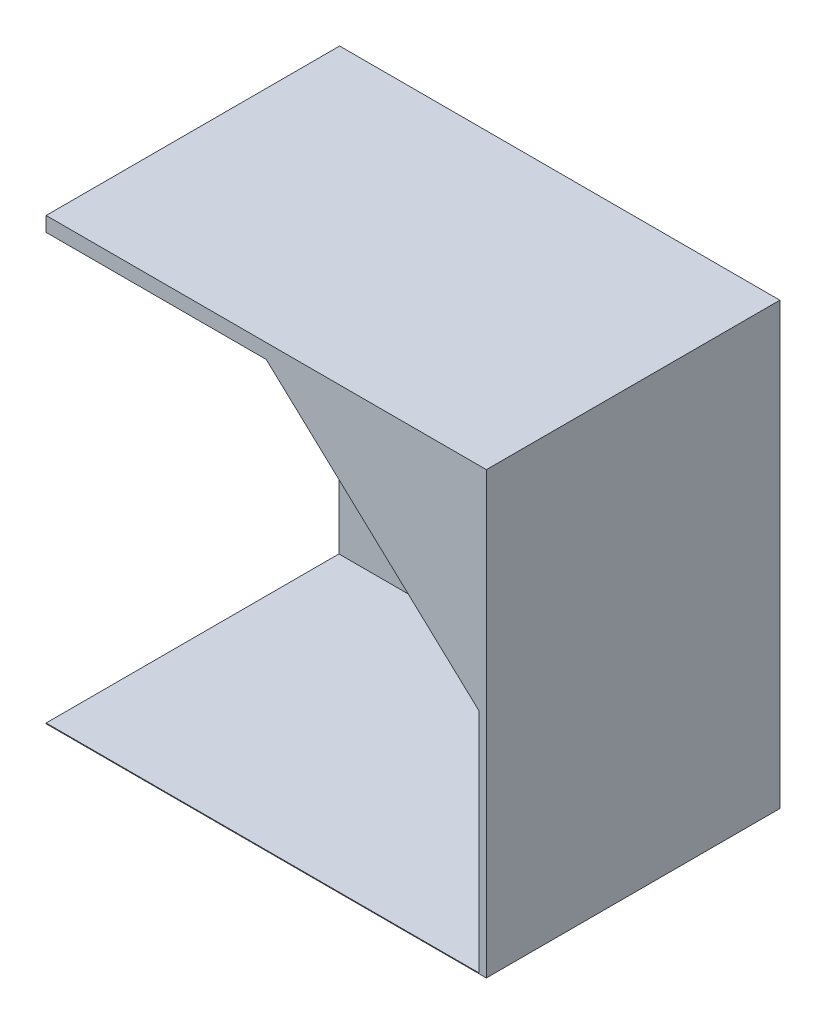
ISO-10303-21;
HEADER;
FILE_DESCRIPTION(('STEP AP214'),'2;1');
FILE_NAME('part.step','',(''),(''),'','','');
FILE_SCHEMA(('AUTOMOTIVE_DESIGN { 1 0 10303 214 1 1 1 1 }'));
ENDSEC;
DATA;
#1=APPLICATION_CONTEXT('core data for automotive mechanical design processes');
#2=APPLICATION_PROTOCOL_DEFINITION('international standard','automotive_design',2000,#1);
#3=PRODUCT_CONTEXT('',#1,'mechanical');
#4=PRODUCT('Part','Part','',(#3));
#5=PRODUCT_RELATED_PRODUCT_CATEGORY('part','',(#4));
#6=PRODUCT_DEFINITION_FORMATION('','',#4);
#7=PRODUCT_DEFINITION_CONTEXT('part definition',#1,'design');
#8=PRODUCT_DEFINITION('design','',#6,#7);
#9=PRODUCT_DEFINITION_SHAPE('','',#8);
#10=(LENGTH_UNIT() NAMED_UNIT(*) SI_UNIT(.MILLI.,.METRE.));
#11=(NAMED_UNIT(*) PLANE_ANGLE_UNIT() SI_UNIT($,.RADIAN.));
#12=(NAMED_UNIT(*) SI_UNIT($,.STERADIAN.) SOLID_ANGLE_UNIT());
#13=UNCERTAINTY_MEASURE_WITH_UNIT(LENGTH_MEASURE(1.E-05),#10,'distance_accuracy_value','');
#14=(GEOMETRIC_REPRESENTATION_CONTEXT(3) GLOBAL_UNCERTAINTY_ASSIGNED_CONTEXT((#13)) GLOBAL_UNIT_ASSIGNED_CONTEXT((#10,
#11,#12)) REPRESENTATION_CONTEXT('',''));
#15=CARTESIAN_POINT('',(0.,0.,0.));
#16=DIRECTION('',(0.,0.,1.));
#17=DIRECTION('',(1.,0.,0.));
#18=AXIS2_PLACEMENT_3D('',#15,#16,#17);
#19=CARTESIAN_POINT('',(-1500.,-1500.,2000.));
#20=DIRECTION('',(1.,0.,0.));
#21=DIRECTION('',(0.,0.,-1.));
#22=AXIS2_PLACEMENT_3D('',#19,#20,#21);
#23=PLANE('',#22);
#24=DIRECTION('',(0.,-1.,0.));
#25=VECTOR('',#24,1.);
#26=CARTESIAN_POINT('',(-1500.,-1500.,2000.));
#27=LINE('',#26,#25);
#28=CARTESIAN_POINT('',(-1500.,-1495.,2000.));
#29=VERTEX_POINT('',#28);
#30=CARTESIAN_POINT('',(-1500.,-1500.,2000.));
#31=VERTEX_POINT('',#30);
#32=EDGE_CURVE('E84',#29,#31,#27,.T.);
#33=ORIENTED_EDGE('',*,*,#32,.F.);
#34=DIRECTION('',(0.,0.,-1.));
#35=VECTOR('',#34,1.);
#36=CARTESIAN_POINT('',(-1500.,-1495.,2000.000012));
#37=LINE('',#36,#35);
#38=CARTESIAN_POINT('',(-1500.,-1495.,4.99999999999989));
#39=VERTEX_POINT('',#38);
#40=EDGE_CURVE('E149',#29,#39,#37,.T.);
#41=ORIENTED_EDGE('',*,*,#40,.T.);
#42=DIRECTION('',(0.,-1.,0.));
#43=VECTOR('',#42,1.);
#44=CARTESIAN_POINT('',(-1500.,0.,4.99999999999989));
#45=LINE('',#44,#43);
#46=CARTESIAN_POINT('',(-1500.,1400.,4.99999999999989));
#47=VERTEX_POINT('',#46);
#48=EDGE_CURVE('E134',#47,#39,#45,.T.);
#49=ORIENTED_EDGE('',*,*,#48,.F.);
#50=DIRECTION('',(0.,0.,-1.));
#51=VECTOR('',#50,1.);
#52=CARTESIAN_POINT('',(-1500.,1400.,2000.000012));
#53=LINE('',#52,#51);
#54=CARTESIAN_POINT('',(-1500.,1400.,2000.));
#55=VERTEX_POINT('',#54);
#56=EDGE_CURVE('E151',#55,#47,#53,.T.);
#57=ORIENTED_EDGE('',*,*,#56,.F.);
#58=CARTESIAN_POINT('',(-1500.,1500.,2000.));
#59=VERTEX_POINT('',#58);
#60=EDGE_CURVE('E155',#59,#55,#27,.T.);
#61=ORIENTED_EDGE('',*,*,#60,.F.);
#62=DIRECTION('',(0.,0.,-1.));
#63=VECTOR('',#62,1.);
#64=CARTESIAN_POINT('',(-1500.,1500.,2000.));
#65=LINE('',#64,#63);
#66=CARTESIAN_POINT('',(-1500.,1500.,0.));
#67=VERTEX_POINT('',#66);
#68=EDGE_CURVE('E162',#59,#67,#65,.T.);
#69=ORIENTED_EDGE('',*,*,#68,.T.);
#70=DIRECTION('',(0.,-1.,0.));
#71=VECTOR('',#70,1.);
#72=CARTESIAN_POINT('',(-1500.,-1500.,0.));
#73=LINE('',#72,#71);
#74=CARTESIAN_POINT('',(-1500.,-1500.,0.));
#75=VERTEX_POINT('',#74);
#76=EDGE_CURVE('E119',#67,#75,#73,.T.);
#77=ORIENTED_EDGE('',*,*,#76,.T.);
#78=DIRECTION('',(0.,0.,-1.));
#79=VECTOR('',#78,1.);
#80=CARTESIAN_POINT('',(-1500.,-1500.,2000.));
#81=LINE('',#80,#79);
#82=EDGE_CURVE('E176',#31,#75,#81,.T.);
#83=ORIENTED_EDGE('',*,*,#82,.F.);
#84=EDGE_LOOP('',(#33,#41,#49,#57,#61,#69,#77,#83));
#85=FACE_BOUND('',#84,.T.);
#86=ADVANCED_FACE('F33',(#85),#23,.F.);
#87=CARTESIAN_POINT('',(1500.,-1500.,2000.));
#88=DIRECTION('',(0.,1.,0.));
#89=DIRECTION('',(-1.,0.,0.));
#90=AXIS2_PLACEMENT_3D('',#87,#88,#89);
#91=PLANE('',#90);
#92=DIRECTION('',(1.,0.,0.));
#93=VECTOR('',#92,1.);
#94=CARTESIAN_POINT('',(1500.,-1500.,0.));
#95=LINE('',#94,#93);
#96=CARTESIAN_POINT('',(1500.,-1500.,0.));
#97=VERTEX_POINT('',#96);
#98=EDGE_CURVE('E165',#75,#97,#95,.T.);
#99=ORIENTED_EDGE('',*,*,#98,.T.);
#100=DIRECTION('',(0.,0.,-1.));
#101=VECTOR('',#100,1.);
#102=CARTESIAN_POINT('',(1500.,-1500.,2000.));
#103=LINE('',#102,#101);
#104=CARTESIAN_POINT('',(1500.,-1500.,2000.));
#105=VERTEX_POINT('',#104);
#106=EDGE_CURVE('E173',#105,#97,#103,.T.);
#107=ORIENTED_EDGE('',*,*,#106,.F.);
#108=DIRECTION('',(1.,0.,0.));
#109=VECTOR('',#108,1.);
#110=CARTESIAN_POINT('',(1500.,-1500.,2000.));
#111=LINE('',#110,#109);
#112=EDGE_CURVE('E157',#31,#105,#111,.T.);
#113=ORIENTED_EDGE('',*,*,#112,.F.);
#114=ORIENTED_EDGE('',*,*,#82,.T.);
#115=EDGE_LOOP('',(#99,#107,#113,#114));
#116=FACE_BOUND('',#115,.T.);
#117=ADVANCED_FACE('F194',(#116),#91,.F.);
#118=CARTESIAN_POINT('',(1500.,-1500.,2000.));
#119=DIRECTION('',(-1.,0.,0.));
#120=DIRECTION('',(0.,0.,1.));
#121=AXIS2_PLACEMENT_3D('',#118,#119,#120);
#122=PLANE('',#121);
#123=DIRECTION('',(0.,1.,0.));
#124=VECTOR('',#123,1.);
#125=CARTESIAN_POINT('',(1500.,-1500.,0.));
#126=LINE('',#125,#124);
#127=CARTESIAN_POINT('',(1500.,1500.,0.));
#128=VERTEX_POINT('',#127);
#129=EDGE_CURVE('E167',#97,#128,#126,.T.);
#130=ORIENTED_EDGE('',*,*,#129,.T.);
#131=DIRECTION('',(0.,0.,-1.));
#132=VECTOR('',#131,1.);
#133=CARTESIAN_POINT('',(1500.,1500.,2000.));
#134=LINE('',#133,#132);
#135=CARTESIAN_POINT('',(1500.,1500.,2000.));
#136=VERTEX_POINT('',#135);
#137=EDGE_CURVE('E171',#136,#128,#134,.T.);
#138=ORIENTED_EDGE('',*,*,#137,.F.);
#139=DIRECTION('',(0.,1.,0.));
#140=VECTOR('',#139,1.);
#141=CARTESIAN_POINT('',(1500.,-1500.,2000.));
#142=LINE('',#141,#140);
#143=EDGE_CURVE('E159',#105,#136,#142,.T.);
#144=ORIENTED_EDGE('',*,*,#143,.F.);
#145=ORIENTED_EDGE('',*,*,#106,.T.);
#146=EDGE_LOOP('',(#130,#138,#144,#145));
#147=FACE_BOUND('',#146,.T.);
#148=ADVANCED_FACE('F199',(#147),#122,.F.);
#149=CARTESIAN_POINT('',(1500.,1500.,2000.));
#150=DIRECTION('',(0.,-1.,0.));
#151=DIRECTION('',(1.,0.,0.));
#152=AXIS2_PLACEMENT_3D('',#149,#150,#151);
#153=PLANE('',#152);
#154=DIRECTION('',(-1.,0.,0.));
#155=VECTOR('',#154,1.);
#156=CARTESIAN_POINT('',(1500.,1500.,0.));
#157=LINE('',#156,#155);
#158=EDGE_CURVE('E77',#128,#67,#157,.T.);
#159=ORIENTED_EDGE('',*,*,#158,.T.);
#160=ORIENTED_EDGE('',*,*,#68,.F.);
#161=DIRECTION('',(-1.,0.,0.));
#162=VECTOR('',#161,1.);
#163=CARTESIAN_POINT('',(1500.,1500.,2000.));
#164=LINE('',#163,#162);
#165=EDGE_CURVE('E56',#136,#59,#164,.T.);
#166=ORIENTED_EDGE('',*,*,#165,.F.);
#167=ORIENTED_EDGE('',*,*,#137,.T.);
#168=EDGE_LOOP('',(#159,#160,#166,#167));
#169=FACE_BOUND('',#168,.T.);
#170=ADVANCED_FACE('F201',(#169),#153,.F.);
#171=CARTESIAN_POINT('',(0.,0.,2000.));
#172=DIRECTION('',(0.,0.,1.));
#173=DIRECTION('',(1.,0.,0.));
#174=AXIS2_PLACEMENT_3D('',#171,#172,#173);
#175=PLANE('',#174);
#176=DIRECTION('',(1.,0.,0.));
#177=VECTOR('',#176,1.);
#178=CARTESIAN_POINT('',(0.,-1495.,2000.));
#179=LINE('',#178,#177);
#180=CARTESIAN_POINT('',(1450.,-1495.,2000.));
#181=VERTEX_POINT('',#180);
#182=EDGE_CURVE('E11',#29,#181,#179,.T.);
#183=ORIENTED_EDGE('',*,*,#182,.F.);
#184=ORIENTED_EDGE('',*,*,#32,.T.);
#185=ORIENTED_EDGE('',*,*,#112,.T.);
#186=ORIENTED_EDGE('',*,*,#143,.T.);
#187=ORIENTED_EDGE('',*,*,#165,.T.);
#188=ORIENTED_EDGE('',*,*,#60,.T.);
#189=DIRECTION('',(1.,0.,0.));
#190=VECTOR('',#189,1.);
#191=CARTESIAN_POINT('',(-2.07241631263363E-13,1400.,2000.));
#192=LINE('',#191,#190);
#193=CARTESIAN_POINT('',(-1.30520867677086E-13,1400.,2000.));
#194=VERTEX_POINT('',#193);
#195=EDGE_CURVE('E179',#55,#194,#192,.T.);
#196=ORIENTED_EDGE('',*,*,#195,.T.);
#197=DIRECTION('',(-0.732204352927371,0.681085006114662,0.));
#198=VECTOR('',#197,1.);
#199=CARTESIAN_POINT('',(698.170768667009,750.572500224106,2000.));
#200=LINE('',#199,#198);
#201=CARTESIAN_POINT('',(1450.,51.2327399886134,2000.));
#202=VERTEX_POINT('',#201);
#203=EDGE_CURVE('E182',#202,#194,#200,.T.);
#204=ORIENTED_EDGE('',*,*,#203,.F.);
#205=DIRECTION('',(0.,1.,0.));
#206=VECTOR('',#205,1.);
#207=CARTESIAN_POINT('',(1450.,4.16450471930463E-13,2000.));
#208=LINE('',#207,#206);
#209=EDGE_CURVE('E40',#181,#202,#208,.T.);
#210=ORIENTED_EDGE('',*,*,#209,.F.);
#211=EDGE_LOOP('',(#183,#184,#185,#186,#187,#188,#196,#204,#210));
#212=FACE_BOUND('',#211,.T.);
#213=ADVANCED_FACE('F186',(#212),#175,.T.);
#214=CARTESIAN_POINT('',(0.,0.,0.));
#215=DIRECTION('',(0.,0.,1.));
#216=DIRECTION('',(1.,0.,0.));
#217=AXIS2_PLACEMENT_3D('',#214,#215,#216);
#218=PLANE('',#217);
#219=ORIENTED_EDGE('',*,*,#76,.F.);
#220=ORIENTED_EDGE('',*,*,#158,.F.);
#221=ORIENTED_EDGE('',*,*,#129,.F.);
#222=ORIENTED_EDGE('',*,*,#98,.F.);
#223=EDGE_LOOP('',(#219,#220,#221,#222));
#224=FACE_BOUND('',#223,.T.);
#225=ADVANCED_FACE('F203',(#224),#218,.F.);
#226=CARTESIAN_POINT('',(0.,-1495.,2000.000012));
#227=DIRECTION('',(0.,-1.,0.));
#228=DIRECTION('',(0.,0.,-1.));
#229=AXIS2_PLACEMENT_3D('',#226,#227,#228);
#230=PLANE('',#229);
#231=ORIENTED_EDGE('',*,*,#182,.T.);
#232=DIRECTION('',(0.,0.,-1.));
#233=VECTOR('',#232,1.);
#234=CARTESIAN_POINT('',(1450.,-1495.,2000.000012));
#235=LINE('',#234,#233);
#236=CARTESIAN_POINT('',(1450.,-1495.,4.99999999999989));
#237=VERTEX_POINT('',#236);
#238=EDGE_CURVE('E111',#181,#237,#235,.T.);
#239=ORIENTED_EDGE('',*,*,#238,.T.);
#240=DIRECTION('',(-1.,0.,0.));
#241=VECTOR('',#240,1.);
#242=CARTESIAN_POINT('',(0.,-1495.,4.99999999999989));
#243=LINE('',#242,#241);
#244=EDGE_CURVE('E115',#237,#39,#243,.T.);
#245=ORIENTED_EDGE('',*,*,#244,.T.);
#246=ORIENTED_EDGE('',*,*,#40,.F.);
#247=EDGE_LOOP('',(#231,#239,#245,#246));
#248=FACE_BOUND('',#247,.T.);
#249=ADVANCED_FACE('F113',(#248),#230,.F.);
#250=CARTESIAN_POINT('',(1450.,4.16450471930463E-13,2000.000012));
#251=DIRECTION('',(1.,0.,0.));
#252=DIRECTION('',(0.,1.,0.));
#253=AXIS2_PLACEMENT_3D('',#250,#251,#252);
#254=PLANE('',#253);
#255=ORIENTED_EDGE('',*,*,#209,.T.);
#256=DIRECTION('',(0.,0.,-1.));
#257=VECTOR('',#256,1.);
#258=CARTESIAN_POINT('',(1450.,51.2327399886134,2000.000012));
#259=LINE('',#258,#257);
#260=CARTESIAN_POINT('',(1450.,51.2327399886134,4.99999999999989));
#261=VERTEX_POINT('',#260);
#262=EDGE_CURVE('E120',#202,#261,#259,.T.);
#263=ORIENTED_EDGE('',*,*,#262,.T.);
#264=DIRECTION('',(0.,-1.,0.));
#265=VECTOR('',#264,1.);
#266=CARTESIAN_POINT('',(1450.,4.16450471930463E-13,4.99999999999989));
#267=LINE('',#266,#265);
#268=EDGE_CURVE('E123',#261,#237,#267,.T.);
#269=ORIENTED_EDGE('',*,*,#268,.T.);
#270=ORIENTED_EDGE('',*,*,#238,.F.);
#271=EDGE_LOOP('',(#255,#263,#269,#270));
#272=FACE_BOUND('',#271,.T.);
#273=ADVANCED_FACE('F124',(#272),#254,.F.);
#274=CARTESIAN_POINT('',(698.170768667009,750.572500224106,2000.000012));
#275=DIRECTION('',(0.681085006114662,0.732204352927371,0.));
#276=DIRECTION('',(-0.732204352927371,0.681085006114662,0.));
#277=AXIS2_PLACEMENT_3D('',#274,#275,#276);
#278=PLANE('',#277);
#279=CARTESIAN_POINT('',(725.,725.616369994307,1500.));
#280=DIRECTION('',(-0.681085006114662,-0.732204352927371,0.));
#281=DIRECTION('',(0.732204352927371,-0.681085006114662,0.));
#282=AXIS2_PLACEMENT_3D('',#279,#280,#281);
#283=CIRCLE('',#282,100.);
#284=CARTESIAN_POINT('',(798.220435292737,657.507869382841,1500.));
#285=VERTEX_POINT('',#284);
#286=EDGE_CURVE('E139',#285,#285,#283,.T.);
#287=ORIENTED_EDGE('',*,*,#286,.F.);
#288=EDGE_LOOP('',(#287));
#289=FACE_BOUND('',#288,.T.);
#290=CARTESIAN_POINT('',(725.,725.616369994307,1002.5));
#291=DIRECTION('',(-0.681085006114662,-0.732204352927371,0.));
#292=DIRECTION('',(0.732204352927371,-0.681085006114662,0.));
#293=AXIS2_PLACEMENT_3D('',#290,#291,#292);
#294=CIRCLE('',#293,100.);
#295=CARTESIAN_POINT('',(798.220435292737,657.507869382841,1002.5));
#296=VERTEX_POINT('',#295);
#297=EDGE_CURVE('E344',#296,#296,#294,.T.);
#298=ORIENTED_EDGE('',*,*,#297,.F.);
#299=EDGE_LOOP('',(#298));
#300=FACE_BOUND('',#299,.T.);
#301=CARTESIAN_POINT('',(725.,725.616369994307,500.));
#302=DIRECTION('',(-0.681085006114662,-0.732204352927371,0.));
#303=DIRECTION('',(0.732204352927371,-0.681085006114662,0.));
#304=AXIS2_PLACEMENT_3D('',#301,#302,#303);
#305=CIRCLE('',#304,100.);
#306=CARTESIAN_POINT('',(798.220435292737,657.507869382841,500.));
#307=VERTEX_POINT('',#306);
#308=EDGE_CURVE('E142',#307,#307,#305,.T.);
#309=ORIENTED_EDGE('',*,*,#308,.F.);
#310=EDGE_LOOP('',(#309));
#311=FACE_BOUND('',#310,.T.);
#312=ORIENTED_EDGE('',*,*,#203,.T.);
#313=DIRECTION('',(0.,0.,-1.));
#314=VECTOR('',#313,1.);
#315=CARTESIAN_POINT('',(-1.30520867677086E-13,1400.,2000.000012));
#316=LINE('',#315,#314);
#317=CARTESIAN_POINT('',(-1.30520867677086E-13,1400.,4.99999999999989));
#318=VERTEX_POINT('',#317);
#319=EDGE_CURVE('E47',#194,#318,#316,.T.);
#320=ORIENTED_EDGE('',*,*,#319,.T.);
#321=DIRECTION('',(0.732204352927371,-0.681085006114662,0.));
#322=VECTOR('',#321,1.);
#323=CARTESIAN_POINT('',(698.170768667009,750.572500224106,4.99999999999989));
#324=LINE('',#323,#322);
#325=EDGE_CURVE('E129',#318,#261,#324,.T.);
#326=ORIENTED_EDGE('',*,*,#325,.T.);
#327=ORIENTED_EDGE('',*,*,#262,.F.);
#328=EDGE_LOOP('',(#312,#320,#326,#327));
#329=FACE_BOUND('',#328,.T.);
#330=ADVANCED_FACE('F185',(#289,#300,#311,#329),#278,.F.);
#331=CARTESIAN_POINT('',(-2.07241631263363E-13,1400.,2000.000012));
#332=DIRECTION('',(0.,-1.,0.));
#333=DIRECTION('',(1.,0.,0.));
#334=AXIS2_PLACEMENT_3D('',#331,#332,#333);
#335=PLANE('',#334);
#336=ORIENTED_EDGE('',*,*,#56,.T.);
#337=DIRECTION('',(-1.,0.,0.));
#338=VECTOR('',#337,1.);
#339=CARTESIAN_POINT('',(-2.07241631263363E-13,1400.,4.99999999999989));
#340=LINE('',#339,#338);
#341=EDGE_CURVE('E146',#318,#47,#340,.T.);
#342=ORIENTED_EDGE('',*,*,#341,.F.);
#343=ORIENTED_EDGE('',*,*,#319,.F.);
#344=ORIENTED_EDGE('',*,*,#195,.F.);
#345=EDGE_LOOP('',(#336,#342,#343,#344));
#346=FACE_BOUND('',#345,.T.);
#347=ADVANCED_FACE('F189',(#346),#335,.T.);
#348=CARTESIAN_POINT('',(0.,0.,4.99999999999989));
#349=DIRECTION('',(0.,0.,1.));
#350=DIRECTION('',(1.,0.,0.));
#351=AXIS2_PLACEMENT_3D('',#348,#349,#350);
#352=PLANE('',#351);
#353=ORIENTED_EDGE('',*,*,#244,.F.);
#354=ORIENTED_EDGE('',*,*,#268,.F.);
#355=ORIENTED_EDGE('',*,*,#325,.F.);
#356=ORIENTED_EDGE('',*,*,#341,.T.);
#357=ORIENTED_EDGE('',*,*,#48,.T.);
#358=EDGE_LOOP('',(#353,#354,#355,#356,#357));
#359=FACE_BOUND('',#358,.T.);
#360=ADVANCED_FACE('F131',(#359),#352,.T.);
#361=CARTESIAN_POINT('',(738.621700122293,740.260457052854,500.));
#362=DIRECTION('',(-0.681085006114662,-0.732204352927371,0.));
#363=DIRECTION('',(0.732204352927371,-0.681085006114662,0.));
#364=AXIS2_PLACEMENT_3D('',#361,#362,#363);
#365=CYLINDRICAL_SURFACE('',#364,100.);
#366=CARTESIAN_POINT('',(738.621700122293,740.260457052854,500.));
#367=DIRECTION('',(-0.681085006114662,-0.732204352927371,0.));
#368=DIRECTION('',(0.732204352927371,-0.681085006114662,0.));
#369=AXIS2_PLACEMENT_3D('',#366,#367,#368);
#370=CIRCLE('',#369,100.);
#371=CARTESIAN_POINT('',(811.84213541503,672.151956441388,500.));
#372=VERTEX_POINT('',#371);
#373=EDGE_CURVE('E348',#372,#372,#370,.T.);
#374=ORIENTED_EDGE('',*,*,#373,.F.);
#375=EDGE_LOOP('',(#374));
#376=FACE_BOUND('',#375,.T.);
#377=ORIENTED_EDGE('',*,*,#308,.T.);
#378=EDGE_LOOP('',(#377));
#379=FACE_BOUND('',#378,.T.);
#380=ADVANCED_FACE('F267',(#376,#379),#365,.F.);
#381=CARTESIAN_POINT('',(738.621700122293,740.260457052854,500.));
#382=DIRECTION('',(-0.681085006114662,-0.732204352927371,0.));
#383=DIRECTION('',(0.732204352927371,-0.681085006114662,0.));
#384=AXIS2_PLACEMENT_3D('',#381,#382,#383);
#385=PLANE('',#384);
#386=ORIENTED_EDGE('',*,*,#373,.T.);
#387=EDGE_LOOP('',(#386));
#388=FACE_BOUND('',#387,.T.);
#389=ADVANCED_FACE('F283',(#388),#385,.T.);
#390=CARTESIAN_POINT('',(738.621700122293,740.260457052854,1002.5));
#391=DIRECTION('',(-0.681085006114662,-0.732204352927371,0.));
#392=DIRECTION('',(0.732204352927371,-0.681085006114662,0.));
#393=AXIS2_PLACEMENT_3D('',#390,#391,#392);
#394=CYLINDRICAL_SURFACE('',#393,100.);
#395=CARTESIAN_POINT('',(738.621700122293,740.260457052854,1002.5));
#396=DIRECTION('',(-0.681085006114662,-0.732204352927371,0.));
#397=DIRECTION('',(0.732204352927371,-0.681085006114662,0.));
#398=AXIS2_PLACEMENT_3D('',#395,#396,#397);
#399=CIRCLE('',#398,100.);
#400=CARTESIAN_POINT('',(811.842135415031,672.151956441388,1002.5));
#401=VERTEX_POINT('',#400);
#402=EDGE_CURVE('E341',#401,#401,#399,.T.);
#403=ORIENTED_EDGE('',*,*,#402,.F.);
#404=EDGE_LOOP('',(#403));
#405=FACE_BOUND('',#404,.T.);
#406=ORIENTED_EDGE('',*,*,#297,.T.);
#407=EDGE_LOOP('',(#406));
#408=FACE_BOUND('',#407,.T.);
#409=ADVANCED_FACE('F293',(#405,#408),#394,.F.);
#410=CARTESIAN_POINT('',(738.621700122293,740.260457052854,1002.5));
#411=DIRECTION('',(-0.681085006114662,-0.732204352927371,0.));
#412=DIRECTION('',(0.732204352927371,-0.681085006114662,0.));
#413=AXIS2_PLACEMENT_3D('',#410,#411,#412);
#414=PLANE('',#413);
#415=ORIENTED_EDGE('',*,*,#402,.T.);
#416=EDGE_LOOP('',(#415));
#417=FACE_BOUND('',#416,.T.);
#418=ADVANCED_FACE('F303',(#417),#414,.T.);
#419=CARTESIAN_POINT('',(738.621700122293,740.260457052854,1500.));
#420=DIRECTION('',(-0.681085006114662,-0.732204352927371,0.));
#421=DIRECTION('',(0.732204352927371,-0.681085006114662,0.));
#422=AXIS2_PLACEMENT_3D('',#419,#420,#421);
#423=CYLINDRICAL_SURFACE('',#422,100.);
#424=CARTESIAN_POINT('',(738.621700122293,740.260457052854,1500.));
#425=DIRECTION('',(-0.681085006114662,-0.732204352927371,0.));
#426=DIRECTION('',(0.732204352927371,-0.681085006114662,0.));
#427=AXIS2_PLACEMENT_3D('',#424,#425,#426);
#428=CIRCLE('',#427,100.);
#429=CARTESIAN_POINT('',(811.842135415031,672.151956441388,1500.));
#430=VERTEX_POINT('',#429);
#431=EDGE_CURVE('E136',#430,#430,#428,.T.);
#432=ORIENTED_EDGE('',*,*,#431,.F.);
#433=EDGE_LOOP('',(#432));
#434=FACE_BOUND('',#433,.T.);
#435=ORIENTED_EDGE('',*,*,#286,.T.);
#436=EDGE_LOOP('',(#435));
#437=FACE_BOUND('',#436,.T.);
#438=ADVANCED_FACE('F313',(#434,#437),#423,.F.);
#439=CARTESIAN_POINT('',(738.621700122293,740.260457052854,1500.));
#440=DIRECTION('',(-0.681085006114662,-0.732204352927371,0.));
#441=DIRECTION('',(0.732204352927371,-0.681085006114662,0.));
#442=AXIS2_PLACEMENT_3D('',#439,#440,#441);
#443=PLANE('',#442);
#444=ORIENTED_EDGE('',*,*,#431,.T.);
#445=EDGE_LOOP('',(#444));
#446=FACE_BOUND('',#445,.T.);
#447=ADVANCED_FACE('F323',(#446),#443,.T.);
#448=CLOSED_SHELL('',(#86,#117,#148,#170,#213,#225,#249,#273,#330,#347,#360,#380,#389,#409,#418,
#438,#447));
#449=MANIFOLD_SOLID_BREP('B2',#448);
#450=ADVANCED_BREP_SHAPE_REPRESENTATION('',(#18,#449),#14);
#451=SHAPE_DEFINITION_REPRESENTATION(#9,#450);
ENDSEC;
END-ISO-10303-21;
